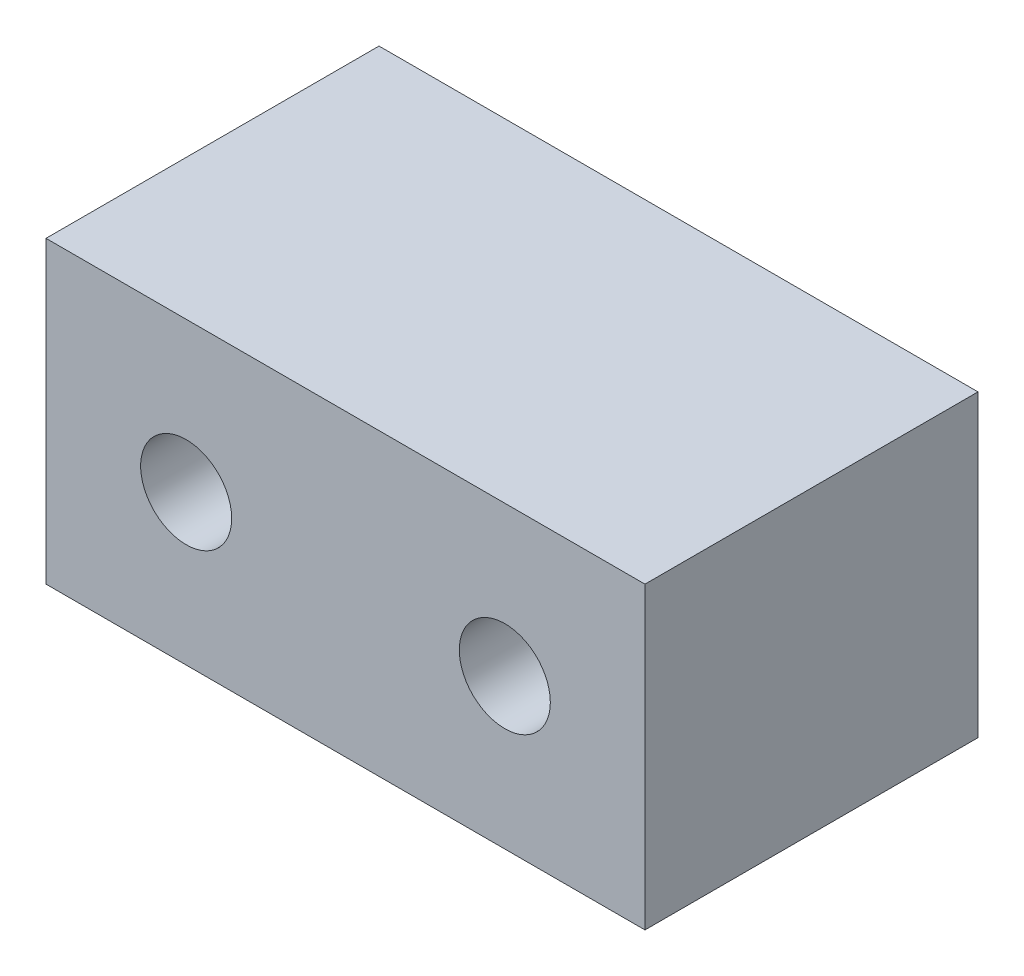
ISO-10303-21;
HEADER;
FILE_DESCRIPTION(('STEP AP214'),'2;1');
FILE_NAME('part.step','',(''),(''),'','','');
FILE_SCHEMA(('AUTOMOTIVE_DESIGN { 1 0 10303 214 1 1 1 1 }'));
ENDSEC;
DATA;
#1=APPLICATION_CONTEXT('core data for automotive mechanical design processes');
#2=APPLICATION_PROTOCOL_DEFINITION('international standard','automotive_design',2000,#1);
#3=PRODUCT_CONTEXT('',#1,'mechanical');
#4=PRODUCT('Part','Part','',(#3));
#5=PRODUCT_RELATED_PRODUCT_CATEGORY('part','',(#4));
#6=PRODUCT_DEFINITION_FORMATION('','',#4);
#7=PRODUCT_DEFINITION_CONTEXT('part definition',#1,'design');
#8=PRODUCT_DEFINITION('design','',#6,#7);
#9=PRODUCT_DEFINITION_SHAPE('','',#8);
#10=(LENGTH_UNIT() NAMED_UNIT(*) SI_UNIT(.MILLI.,.METRE.));
#11=(NAMED_UNIT(*) PLANE_ANGLE_UNIT() SI_UNIT($,.RADIAN.));
#12=(NAMED_UNIT(*) SI_UNIT($,.STERADIAN.) SOLID_ANGLE_UNIT());
#13=UNCERTAINTY_MEASURE_WITH_UNIT(LENGTH_MEASURE(1.E-05),#10,'distance_accuracy_value','');
#14=(GEOMETRIC_REPRESENTATION_CONTEXT(3) GLOBAL_UNCERTAINTY_ASSIGNED_CONTEXT((#13)) GLOBAL_UNIT_ASSIGNED_CONTEXT((#10,
#11,#12)) REPRESENTATION_CONTEXT('',''));
#15=CARTESIAN_POINT('',(0.,0.,0.));
#16=DIRECTION('',(0.,0.,1.));
#17=DIRECTION('',(1.,0.,0.));
#18=AXIS2_PLACEMENT_3D('',#15,#16,#17);
#19=CARTESIAN_POINT('',(0.,0.,0.));
#20=DIRECTION('',(0.,0.,1.));
#21=DIRECTION('',(1.,0.,0.));
#22=AXIS2_PLACEMENT_3D('',#19,#20,#21);
#23=PLANE('',#22);
#24=DIRECTION('',(1.,0.,0.));
#25=VECTOR('',#24,1.);
#26=CARTESIAN_POINT('',(0.,-3.175,0.));
#27=LINE('',#26,#25);
#28=CARTESIAN_POINT('',(-6.35,-3.175,0.));
#29=VERTEX_POINT('',#28);
#30=CARTESIAN_POINT('',(6.35,-3.175,0.));
#31=VERTEX_POINT('',#30);
#32=EDGE_CURVE('E107',#29,#31,#27,.T.);
#33=ORIENTED_EDGE('',*,*,#32,.F.);
#34=DIRECTION('',(0.,1.,0.));
#35=VECTOR('',#34,1.);
#36=CARTESIAN_POINT('',(-6.35,0.,0.));
#37=LINE('',#36,#35);
#38=CARTESIAN_POINT('',(-6.35,3.175,0.));
#39=VERTEX_POINT('',#38);
#40=EDGE_CURVE('E113',#29,#39,#37,.T.);
#41=ORIENTED_EDGE('',*,*,#40,.T.);
#42=DIRECTION('',(1.,0.,0.));
#43=VECTOR('',#42,1.);
#44=CARTESIAN_POINT('',(0.,3.175,0.));
#45=LINE('',#44,#43);
#46=CARTESIAN_POINT('',(6.35,3.175,0.));
#47=VERTEX_POINT('',#46);
#48=EDGE_CURVE('E111',#39,#47,#45,.T.);
#49=ORIENTED_EDGE('',*,*,#48,.T.);
#50=DIRECTION('',(0.,1.,0.));
#51=VECTOR('',#50,1.);
#52=CARTESIAN_POINT('',(6.35,0.,0.));
#53=LINE('',#52,#51);
#54=EDGE_CURVE('E92',#31,#47,#53,.T.);
#55=ORIENTED_EDGE('',*,*,#54,.F.);
#56=EDGE_LOOP('',(#33,#41,#49,#55));
#57=FACE_BOUND('',#56,.T.);
#58=CARTESIAN_POINT('',(-3.3782,0.,0.));
#59=DIRECTION('',(0.,0.,1.));
#60=DIRECTION('',(1.,0.,0.));
#61=AXIS2_PLACEMENT_3D('',#58,#59,#60);
#62=CIRCLE('',#61,1.9939);
#63=CARTESIAN_POINT('',(-1.3843,0.,0.));
#64=VERTEX_POINT('',#63);
#65=EDGE_CURVE('E119',#64,#64,#62,.T.);
#66=ORIENTED_EDGE('',*,*,#65,.T.);
#67=EDGE_LOOP('',(#66));
#68=FACE_BOUND('',#67,.T.);
#69=CARTESIAN_POINT('',(3.3782,0.,0.));
#70=DIRECTION('',(0.,0.,1.));
#71=DIRECTION('',(1.,0.,0.));
#72=AXIS2_PLACEMENT_3D('',#69,#70,#71);
#73=CIRCLE('',#72,1.9939);
#74=CARTESIAN_POINT('',(5.3721,0.,0.));
#75=VERTEX_POINT('',#74);
#76=EDGE_CURVE('E126',#75,#75,#73,.F.);
#77=ORIENTED_EDGE('',*,*,#76,.F.);
#78=EDGE_LOOP('',(#77));
#79=FACE_BOUND('',#78,.T.);
#80=ADVANCED_FACE('F36',(#57,#68,#79),#23,.F.);
#81=CARTESIAN_POINT('',(0.,-3.175,7.0612));
#82=DIRECTION('',(0.,1.,0.));
#83=DIRECTION('',(0.,0.,1.));
#84=AXIS2_PLACEMENT_3D('',#81,#82,#83);
#85=PLANE('',#84);
#86=ORIENTED_EDGE('',*,*,#32,.T.);
#87=DIRECTION('',(0.,0.,-1.));
#88=VECTOR('',#87,1.);
#89=CARTESIAN_POINT('',(6.35,-3.175,7.0612));
#90=LINE('',#89,#88);
#91=CARTESIAN_POINT('',(6.35,-3.175,7.0612));
#92=VERTEX_POINT('',#91);
#93=EDGE_CURVE('E11',#92,#31,#90,.T.);
#94=ORIENTED_EDGE('',*,*,#93,.F.);
#95=DIRECTION('',(1.,0.,0.));
#96=VECTOR('',#95,1.);
#97=CARTESIAN_POINT('',(0.,-3.175,7.0612));
#98=LINE('',#97,#96);
#99=CARTESIAN_POINT('',(-6.35,-3.175,7.0612));
#100=VERTEX_POINT('',#99);
#101=EDGE_CURVE('E87',#100,#92,#98,.T.);
#102=ORIENTED_EDGE('',*,*,#101,.F.);
#103=DIRECTION('',(0.,0.,-1.));
#104=VECTOR('',#103,1.);
#105=CARTESIAN_POINT('',(-6.35,-3.175,7.0612));
#106=LINE('',#105,#104);
#107=EDGE_CURVE('E53',#100,#29,#106,.T.);
#108=ORIENTED_EDGE('',*,*,#107,.T.);
#109=EDGE_LOOP('',(#86,#94,#102,#108));
#110=FACE_BOUND('',#109,.T.);
#111=ADVANCED_FACE('F38',(#110),#85,.F.);
#112=CARTESIAN_POINT('',(6.35,0.,7.0612));
#113=DIRECTION('',(-1.,0.,0.));
#114=DIRECTION('',(0.,-1.,0.));
#115=AXIS2_PLACEMENT_3D('',#112,#113,#114);
#116=PLANE('',#115);
#117=ORIENTED_EDGE('',*,*,#54,.T.);
#118=DIRECTION('',(0.,0.,-1.));
#119=VECTOR('',#118,1.);
#120=CARTESIAN_POINT('',(6.35,3.175,7.0612));
#121=LINE('',#120,#119);
#122=CARTESIAN_POINT('',(6.35,3.175,7.0612));
#123=VERTEX_POINT('',#122);
#124=EDGE_CURVE('E45',#123,#47,#121,.T.);
#125=ORIENTED_EDGE('',*,*,#124,.F.);
#126=DIRECTION('',(0.,1.,0.));
#127=VECTOR('',#126,1.);
#128=CARTESIAN_POINT('',(6.35,0.,7.0612));
#129=LINE('',#128,#127);
#130=EDGE_CURVE('E78',#92,#123,#129,.T.);
#131=ORIENTED_EDGE('',*,*,#130,.F.);
#132=ORIENTED_EDGE('',*,*,#93,.T.);
#133=EDGE_LOOP('',(#117,#125,#131,#132));
#134=FACE_BOUND('',#133,.T.);
#135=ADVANCED_FACE('F91',(#134),#116,.F.);
#136=CARTESIAN_POINT('',(0.,3.175,7.0612));
#137=DIRECTION('',(0.,1.,0.));
#138=DIRECTION('',(-1.,0.,0.));
#139=AXIS2_PLACEMENT_3D('',#136,#137,#138);
#140=PLANE('',#139);
#141=ORIENTED_EDGE('',*,*,#48,.F.);
#142=DIRECTION('',(0.,0.,-1.));
#143=VECTOR('',#142,1.);
#144=CARTESIAN_POINT('',(-6.35,3.175,7.0612));
#145=LINE('',#144,#143);
#146=CARTESIAN_POINT('',(-6.35,3.175,7.0612));
#147=VERTEX_POINT('',#146);
#148=EDGE_CURVE('E67',#147,#39,#145,.T.);
#149=ORIENTED_EDGE('',*,*,#148,.F.);
#150=DIRECTION('',(1.,0.,0.));
#151=VECTOR('',#150,1.);
#152=CARTESIAN_POINT('',(0.,3.175,7.0612));
#153=LINE('',#152,#151);
#154=EDGE_CURVE('E86',#147,#123,#153,.T.);
#155=ORIENTED_EDGE('',*,*,#154,.T.);
#156=ORIENTED_EDGE('',*,*,#124,.T.);
#157=EDGE_LOOP('',(#141,#149,#155,#156));
#158=FACE_BOUND('',#157,.T.);
#159=ADVANCED_FACE('F95',(#158),#140,.T.);
#160=CARTESIAN_POINT('',(3.3782,0.,7.0612));
#161=DIRECTION('',(0.,0.,-1.));
#162=DIRECTION('',(-1.,0.,0.));
#163=AXIS2_PLACEMENT_3D('',#160,#161,#162);
#164=CYLINDRICAL_SURFACE('',#163,0.9652);
#165=CARTESIAN_POINT('',(3.3782,0.,3.556));
#166=DIRECTION('',(0.,0.,1.));
#167=DIRECTION('',(1.,0.,0.));
#168=AXIS2_PLACEMENT_3D('',#165,#166,#167);
#169=CIRCLE('',#168,0.9652);
#170=CARTESIAN_POINT('',(4.3434,0.,3.556));
#171=VERTEX_POINT('',#170);
#172=EDGE_CURVE('E109',#171,#171,#169,.F.);
#173=ORIENTED_EDGE('',*,*,#172,.T.);
#174=EDGE_LOOP('',(#173));
#175=FACE_BOUND('',#174,.T.);
#176=CARTESIAN_POINT('',(3.3782,0.,7.0612));
#177=DIRECTION('',(0.,0.,1.));
#178=DIRECTION('',(1.,0.,0.));
#179=AXIS2_PLACEMENT_3D('',#176,#177,#178);
#180=CIRCLE('',#179,0.9652);
#181=CARTESIAN_POINT('',(4.3434,0.,7.0612));
#182=VERTEX_POINT('',#181);
#183=EDGE_CURVE('E98',#182,#182,#180,.F.);
#184=ORIENTED_EDGE('',*,*,#183,.F.);
#185=EDGE_LOOP('',(#184));
#186=FACE_BOUND('',#185,.T.);
#187=ADVANCED_FACE('F161',(#175,#186),#164,.F.);
#188=CARTESIAN_POINT('',(-6.35,0.,7.0612));
#189=DIRECTION('',(-1.,0.,0.));
#190=DIRECTION('',(0.,0.,1.));
#191=AXIS2_PLACEMENT_3D('',#188,#189,#190);
#192=PLANE('',#191);
#193=ORIENTED_EDGE('',*,*,#40,.F.);
#194=ORIENTED_EDGE('',*,*,#107,.F.);
#195=DIRECTION('',(0.,1.,0.));
#196=VECTOR('',#195,1.);
#197=CARTESIAN_POINT('',(-6.35,0.,7.0612));
#198=LINE('',#197,#196);
#199=EDGE_CURVE('E96',#100,#147,#198,.T.);
#200=ORIENTED_EDGE('',*,*,#199,.T.);
#201=ORIENTED_EDGE('',*,*,#148,.T.);
#202=EDGE_LOOP('',(#193,#194,#200,#201));
#203=FACE_BOUND('',#202,.T.);
#204=ADVANCED_FACE('F159',(#203),#192,.T.);
#205=CARTESIAN_POINT('',(-3.3782,0.,7.0612));
#206=DIRECTION('',(0.,0.,-1.));
#207=DIRECTION('',(-1.,0.,0.));
#208=AXIS2_PLACEMENT_3D('',#205,#206,#207);
#209=CYLINDRICAL_SURFACE('',#208,0.9652);
#210=CARTESIAN_POINT('',(-3.3782,0.,3.556));
#211=DIRECTION('',(0.,0.,1.));
#212=DIRECTION('',(1.,0.,0.));
#213=AXIS2_PLACEMENT_3D('',#210,#211,#212);
#214=CIRCLE('',#213,0.9652);
#215=CARTESIAN_POINT('',(-2.413,0.,3.556));
#216=VERTEX_POINT('',#215);
#217=EDGE_CURVE('E122',#216,#216,#214,.T.);
#218=ORIENTED_EDGE('',*,*,#217,.F.);
#219=EDGE_LOOP('',(#218));
#220=FACE_BOUND('',#219,.T.);
#221=CARTESIAN_POINT('',(-3.3782,0.,7.0612));
#222=DIRECTION('',(0.,0.,1.));
#223=DIRECTION('',(1.,0.,0.));
#224=AXIS2_PLACEMENT_3D('',#221,#222,#223);
#225=CIRCLE('',#224,0.9652);
#226=CARTESIAN_POINT('',(-2.413,0.,7.0612));
#227=VERTEX_POINT('',#226);
#228=EDGE_CURVE('E104',#227,#227,#225,.T.);
#229=ORIENTED_EDGE('',*,*,#228,.T.);
#230=EDGE_LOOP('',(#229));
#231=FACE_BOUND('',#230,.T.);
#232=ADVANCED_FACE('F156',(#220,#231),#209,.F.);
#233=CARTESIAN_POINT('',(0.,0.,7.0612));
#234=DIRECTION('',(0.,0.,1.));
#235=DIRECTION('',(1.,0.,0.));
#236=AXIS2_PLACEMENT_3D('',#233,#234,#235);
#237=PLANE('',#236);
#238=ORIENTED_EDGE('',*,*,#101,.T.);
#239=ORIENTED_EDGE('',*,*,#130,.T.);
#240=ORIENTED_EDGE('',*,*,#154,.F.);
#241=ORIENTED_EDGE('',*,*,#199,.F.);
#242=EDGE_LOOP('',(#238,#239,#240,#241));
#243=FACE_BOUND('',#242,.T.);
#244=ORIENTED_EDGE('',*,*,#183,.T.);
#245=EDGE_LOOP('',(#244));
#246=FACE_BOUND('',#245,.T.);
#247=ORIENTED_EDGE('',*,*,#228,.F.);
#248=EDGE_LOOP('',(#247));
#249=FACE_BOUND('',#248,.T.);
#250=ADVANCED_FACE('F82',(#243,#246,#249),#237,.T.);
#251=CARTESIAN_POINT('',(-3.3782,0.,3.556));
#252=DIRECTION('',(0.,0.,-1.));
#253=DIRECTION('',(-1.,0.,0.));
#254=AXIS2_PLACEMENT_3D('',#251,#252,#253);
#255=CYLINDRICAL_SURFACE('',#254,1.9939);
#256=CARTESIAN_POINT('',(-3.3782,0.,3.556));
#257=DIRECTION('',(0.,0.,1.));
#258=DIRECTION('',(1.,0.,0.));
#259=AXIS2_PLACEMENT_3D('',#256,#257,#258);
#260=CIRCLE('',#259,1.9939);
#261=CARTESIAN_POINT('',(-1.3843,0.,3.556));
#262=VERTEX_POINT('',#261);
#263=EDGE_CURVE('E123',#262,#262,#260,.T.);
#264=ORIENTED_EDGE('',*,*,#263,.T.);
#265=EDGE_LOOP('',(#264));
#266=FACE_BOUND('',#265,.T.);
#267=ORIENTED_EDGE('',*,*,#65,.F.);
#268=EDGE_LOOP('',(#267));
#269=FACE_BOUND('',#268,.T.);
#270=ADVANCED_FACE('F196',(#266,#269),#255,.F.);
#271=CARTESIAN_POINT('',(0.,0.,3.556));
#272=DIRECTION('',(0.,0.,1.));
#273=DIRECTION('',(1.,0.,0.));
#274=AXIS2_PLACEMENT_3D('',#271,#272,#273);
#275=PLANE('',#274);
#276=ORIENTED_EDGE('',*,*,#217,.T.);
#277=EDGE_LOOP('',(#276));
#278=FACE_BOUND('',#277,.T.);
#279=ORIENTED_EDGE('',*,*,#263,.F.);
#280=EDGE_LOOP('',(#279));
#281=FACE_BOUND('',#280,.T.);
#282=ADVANCED_FACE('F143',(#278,#281),#275,.F.);
#283=CARTESIAN_POINT('',(3.3782,0.,3.556));
#284=DIRECTION('',(0.,0.,-1.));
#285=DIRECTION('',(-1.,0.,0.));
#286=AXIS2_PLACEMENT_3D('',#283,#284,#285);
#287=CYLINDRICAL_SURFACE('',#286,1.9939);
#288=CARTESIAN_POINT('',(3.3782,0.,3.556));
#289=DIRECTION('',(0.,0.,1.));
#290=DIRECTION('',(1.,0.,0.));
#291=AXIS2_PLACEMENT_3D('',#288,#289,#290);
#292=CIRCLE('',#291,1.9939);
#293=CARTESIAN_POINT('',(5.3721,0.,3.556));
#294=VERTEX_POINT('',#293);
#295=EDGE_CURVE('E131',#294,#294,#292,.F.);
#296=ORIENTED_EDGE('',*,*,#295,.F.);
#297=EDGE_LOOP('',(#296));
#298=FACE_BOUND('',#297,.T.);
#299=ORIENTED_EDGE('',*,*,#76,.T.);
#300=EDGE_LOOP('',(#299));
#301=FACE_BOUND('',#300,.T.);
#302=ADVANCED_FACE('F140',(#298,#301),#287,.F.);
#303=CARTESIAN_POINT('',(0.,0.,3.556));
#304=DIRECTION('',(0.,0.,1.));
#305=DIRECTION('',(1.,0.,0.));
#306=AXIS2_PLACEMENT_3D('',#303,#304,#305);
#307=PLANE('',#306);
#308=ORIENTED_EDGE('',*,*,#295,.T.);
#309=EDGE_LOOP('',(#308));
#310=FACE_BOUND('',#309,.T.);
#311=ORIENTED_EDGE('',*,*,#172,.F.);
#312=EDGE_LOOP('',(#311));
#313=FACE_BOUND('',#312,.T.);
#314=ADVANCED_FACE('F137',(#310,#313),#307,.F.);
#315=CLOSED_SHELL('',(#80,#111,#135,#159,#187,#204,#232,#250,#270,#282,#302,#314));
#316=MANIFOLD_SOLID_BREP('B2',#315);
#317=ADVANCED_BREP_SHAPE_REPRESENTATION('',(#18,#316),#14);
#318=SHAPE_DEFINITION_REPRESENTATION(#9,#317);
ENDSEC;
END-ISO-10303-21;
